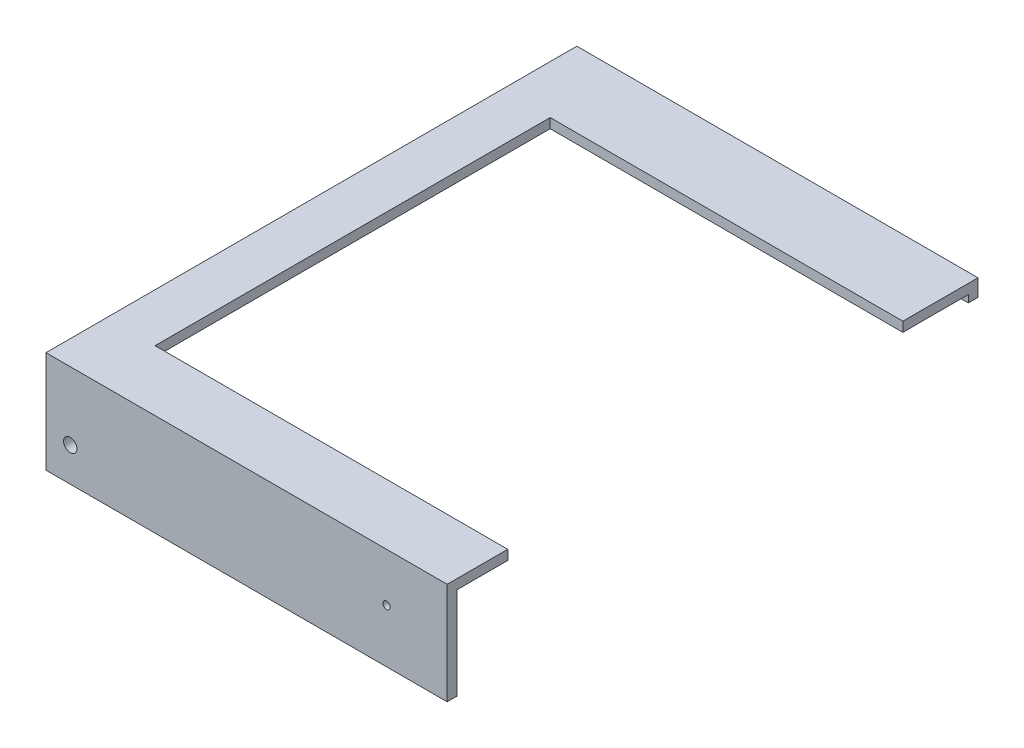
ISO-10303-21;
HEADER;
FILE_DESCRIPTION(('STEP AP214'),'2;1');
FILE_NAME('part.step','',(''),(''),'','','');
FILE_SCHEMA(('AUTOMOTIVE_DESIGN { 1 0 10303 214 1 1 1 1 }'));
ENDSEC;
DATA;
#1=APPLICATION_CONTEXT('core data for automotive mechanical design processes');
#2=APPLICATION_PROTOCOL_DEFINITION('international standard','automotive_design',2000,#1);
#3=PRODUCT_CONTEXT('',#1,'mechanical');
#4=PRODUCT('Part','Part','',(#3));
#5=PRODUCT_RELATED_PRODUCT_CATEGORY('part','',(#4));
#6=PRODUCT_DEFINITION_FORMATION('','',#4);
#7=PRODUCT_DEFINITION_CONTEXT('part definition',#1,'design');
#8=PRODUCT_DEFINITION('design','',#6,#7);
#9=PRODUCT_DEFINITION_SHAPE('','',#8);
#10=(LENGTH_UNIT() NAMED_UNIT(*) SI_UNIT(.MILLI.,.METRE.));
#11=(NAMED_UNIT(*) PLANE_ANGLE_UNIT() SI_UNIT($,.RADIAN.));
#12=(NAMED_UNIT(*) SI_UNIT($,.STERADIAN.) SOLID_ANGLE_UNIT());
#13=UNCERTAINTY_MEASURE_WITH_UNIT(LENGTH_MEASURE(1.E-05),#10,'distance_accuracy_value','');
#14=(GEOMETRIC_REPRESENTATION_CONTEXT(3) GLOBAL_UNCERTAINTY_ASSIGNED_CONTEXT((#13)) GLOBAL_UNIT_ASSIGNED_CONTEXT((#10,
#11,#12)) REPRESENTATION_CONTEXT('',''));
#15=CARTESIAN_POINT('',(0.,0.,0.));
#16=DIRECTION('',(0.,0.,1.));
#17=DIRECTION('',(1.,0.,0.));
#18=AXIS2_PLACEMENT_3D('',#15,#16,#17);
#19=CARTESIAN_POINT('',(0.,0.,-215.));
#20=DIRECTION('',(0.,0.,-1.));
#21=DIRECTION('',(1.,0.,0.));
#22=AXIS2_PLACEMENT_3D('',#19,#20,#21);
#23=PLANE('',#22);
#24=DIRECTION('',(1.,0.,0.));
#25=VECTOR('',#24,1.);
#26=CARTESIAN_POINT('',(0.,0.,-215.));
#27=LINE('',#26,#25);
#28=CARTESIAN_POINT('',(156.61803398875,0.,-215.));
#29=VERTEX_POINT('',#28);
#30=CARTESIAN_POINT('',(165.5,0.,-215.));
#31=VERTEX_POINT('',#30);
#32=EDGE_CURVE('E306',#29,#31,#27,.T.);
#33=ORIENTED_EDGE('',*,*,#32,.F.);
#34=CARTESIAN_POINT('',(155.5,1.,-215.));
#35=DIRECTION('',(0.,0.,-1.));
#36=DIRECTION('',(-1.,0.,0.));
#37=AXIS2_PLACEMENT_3D('',#34,#35,#36);
#38=CIRCLE('',#37,1.5);
#39=CARTESIAN_POINT('',(154.38196601125,0.,-215.));
#40=VERTEX_POINT('',#39);
#41=EDGE_CURVE('E176',#29,#40,#38,.T.);
#42=ORIENTED_EDGE('',*,*,#41,.T.);
#43=CARTESIAN_POINT('',(4.,0.,-215.));
#44=VERTEX_POINT('',#43);
#45=EDGE_CURVE('E174',#44,#40,#27,.T.);
#46=ORIENTED_EDGE('',*,*,#45,.F.);
#47=DIRECTION('',(0.,1.,0.));
#48=VECTOR('',#47,1.);
#49=CARTESIAN_POINT('',(4.,0.,-215.));
#50=LINE('',#49,#48);
#51=CARTESIAN_POINT('',(4.,-3.,-215.));
#52=VERTEX_POINT('',#51);
#53=EDGE_CURVE('E290',#52,#44,#50,.T.);
#54=ORIENTED_EDGE('',*,*,#53,.F.);
#55=DIRECTION('',(1.,0.,0.));
#56=VECTOR('',#55,1.);
#57=CARTESIAN_POINT('',(0.,-3.,-215.));
#58=LINE('',#57,#56);
#59=CARTESIAN_POINT('',(165.5,-3.,-215.));
#60=VERTEX_POINT('',#59);
#61=EDGE_CURVE('E226',#52,#60,#58,.T.);
#62=ORIENTED_EDGE('',*,*,#61,.T.);
#63=DIRECTION('',(0.,1.,0.));
#64=VECTOR('',#63,1.);
#65=CARTESIAN_POINT('',(165.5,4.,-215.));
#66=LINE('',#65,#64);
#67=EDGE_CURVE('E232',#60,#31,#66,.T.);
#68=ORIENTED_EDGE('',*,*,#67,.T.);
#69=EDGE_LOOP('',(#33,#42,#46,#54,#62,#68));
#70=FACE_BOUND('',#69,.T.);
#71=ADVANCED_FACE('F44',(#70),#23,.F.);
#72=CARTESIAN_POINT('',(0.,0.,4.));
#73=DIRECTION('',(1.,0.,0.));
#74=DIRECTION('',(0.,1.,0.));
#75=AXIS2_PLACEMENT_3D('',#72,#73,#74);
#76=PLANE('',#75);
#77=DIRECTION('',(0.,0.,-1.));
#78=VECTOR('',#77,1.);
#79=CARTESIAN_POINT('',(0.,-38.,4.));
#80=LINE('',#79,#78);
#81=CARTESIAN_POINT('',(0.,-38.,0.));
#82=VERTEX_POINT('',#81);
#83=CARTESIAN_POINT('',(0.,-38.,-4.));
#84=VERTEX_POINT('',#83);
#85=EDGE_CURVE('E53',#82,#84,#80,.T.);
#86=ORIENTED_EDGE('',*,*,#85,.F.);
#87=DIRECTION('',(0.,1.,0.));
#88=VECTOR('',#87,1.);
#89=CARTESIAN_POINT('',(0.,-38.,0.));
#90=LINE('',#89,#88);
#91=CARTESIAN_POINT('',(0.,4.,0.));
#92=VERTEX_POINT('',#91);
#93=EDGE_CURVE('E207',#82,#92,#90,.T.);
#94=ORIENTED_EDGE('',*,*,#93,.T.);
#95=DIRECTION('',(0.,0.,1.));
#96=VECTOR('',#95,1.);
#97=CARTESIAN_POINT('',(0.,4.,0.));
#98=LINE('',#97,#96);
#99=CARTESIAN_POINT('',(0.,4.,-219.));
#100=VERTEX_POINT('',#99);
#101=EDGE_CURVE('E339',#100,#92,#98,.T.);
#102=ORIENTED_EDGE('',*,*,#101,.F.);
#103=DIRECTION('',(0.,-1.,0.));
#104=VECTOR('',#103,1.);
#105=CARTESIAN_POINT('',(0.,4.,-219.));
#106=LINE('',#105,#104);
#107=CARTESIAN_POINT('',(0.,-3.,-219.));
#108=VERTEX_POINT('',#107);
#109=EDGE_CURVE('E227',#100,#108,#106,.T.);
#110=ORIENTED_EDGE('',*,*,#109,.T.);
#111=DIRECTION('',(0.,0.,1.));
#112=VECTOR('',#111,1.);
#113=CARTESIAN_POINT('',(0.,-3.,-219.));
#114=LINE('',#113,#112);
#115=CARTESIAN_POINT('',(0.,-3.,-215.));
#116=VERTEX_POINT('',#115);
#117=EDGE_CURVE('E256',#108,#116,#114,.T.);
#118=ORIENTED_EDGE('',*,*,#117,.T.);
#119=DIRECTION('',(0.,-1.,0.));
#120=VECTOR('',#119,1.);
#121=CARTESIAN_POINT('',(0.,4.,-215.));
#122=LINE('',#121,#120);
#123=CARTESIAN_POINT('',(0.,-10.,-215.));
#124=VERTEX_POINT('',#123);
#125=EDGE_CURVE('E312',#116,#124,#122,.T.);
#126=ORIENTED_EDGE('',*,*,#125,.T.);
#127=DIRECTION('',(0.,0.,-1.));
#128=VECTOR('',#127,1.);
#129=CARTESIAN_POINT('',(0.,-10.,-4.));
#130=LINE('',#129,#128);
#131=CARTESIAN_POINT('',(0.,-10.,-4.));
#132=VERTEX_POINT('',#131);
#133=EDGE_CURVE('E282',#132,#124,#130,.T.);
#134=ORIENTED_EDGE('',*,*,#133,.F.);
#135=DIRECTION('',(0.,-1.,0.));
#136=VECTOR('',#135,1.);
#137=CARTESIAN_POINT('',(0.,0.,-4.));
#138=LINE('',#137,#136);
#139=EDGE_CURVE('E321',#132,#84,#138,.T.);
#140=ORIENTED_EDGE('',*,*,#139,.T.);
#141=EDGE_LOOP('',(#86,#94,#102,#110,#118,#126,#134,#140));
#142=FACE_BOUND('',#141,.T.);
#143=ADVANCED_FACE('F46',(#142),#76,.F.);
#144=CARTESIAN_POINT('',(0.,-38.,4.));
#145=DIRECTION('',(0.,1.,0.));
#146=DIRECTION('',(0.,0.,1.));
#147=AXIS2_PLACEMENT_3D('',#144,#145,#146);
#148=PLANE('',#147);
#149=DIRECTION('',(0.,0.,-1.));
#150=VECTOR('',#149,1.);
#151=CARTESIAN_POINT('',(165.5,-38.,4.));
#152=LINE('',#151,#150);
#153=CARTESIAN_POINT('',(165.5,-38.,0.));
#154=VERTEX_POINT('',#153);
#155=CARTESIAN_POINT('',(165.5,-38.,-4.));
#156=VERTEX_POINT('',#155);
#157=EDGE_CURVE('E343',#154,#156,#152,.T.);
#158=ORIENTED_EDGE('',*,*,#157,.F.);
#159=DIRECTION('',(-1.,0.,0.));
#160=VECTOR('',#159,1.);
#161=CARTESIAN_POINT('',(0.,-38.,0.));
#162=LINE('',#161,#160);
#163=EDGE_CURVE('E203',#154,#82,#162,.T.);
#164=ORIENTED_EDGE('',*,*,#163,.T.);
#165=ORIENTED_EDGE('',*,*,#85,.T.);
#166=DIRECTION('',(1.,0.,0.));
#167=VECTOR('',#166,1.);
#168=CARTESIAN_POINT('',(0.,-38.,-4.));
#169=LINE('',#168,#167);
#170=EDGE_CURVE('E325',#84,#156,#169,.T.);
#171=ORIENTED_EDGE('',*,*,#170,.T.);
#172=EDGE_LOOP('',(#158,#164,#165,#171));
#173=FACE_BOUND('',#172,.T.);
#174=ADVANCED_FACE('F403',(#173),#148,.F.);
#175=CARTESIAN_POINT('',(165.5,0.,4.));
#176=DIRECTION('',(-1.,0.,0.));
#177=DIRECTION('',(0.,0.,1.));
#178=AXIS2_PLACEMENT_3D('',#175,#176,#177);
#179=PLANE('',#178);
#180=DIRECTION('',(0.,0.,-1.));
#181=VECTOR('',#180,1.);
#182=CARTESIAN_POINT('',(165.5,4.,0.));
#183=LINE('',#182,#181);
#184=CARTESIAN_POINT('',(165.5,4.,0.));
#185=VERTEX_POINT('',#184);
#186=CARTESIAN_POINT('',(165.5,4.,-25.));
#187=VERTEX_POINT('',#186);
#188=EDGE_CURVE('E336',#185,#187,#183,.T.);
#189=ORIENTED_EDGE('',*,*,#188,.F.);
#190=DIRECTION('',(0.,-1.,0.));
#191=VECTOR('',#190,1.);
#192=CARTESIAN_POINT('',(165.5,0.,0.));
#193=LINE('',#192,#191);
#194=EDGE_CURVE('E218',#185,#154,#193,.T.);
#195=ORIENTED_EDGE('',*,*,#194,.T.);
#196=ORIENTED_EDGE('',*,*,#157,.T.);
#197=DIRECTION('',(0.,1.,0.));
#198=VECTOR('',#197,1.);
#199=CARTESIAN_POINT('',(165.5,0.,-4.));
#200=LINE('',#199,#198);
#201=CARTESIAN_POINT('',(165.5,0.,-4.));
#202=VERTEX_POINT('',#201);
#203=EDGE_CURVE('E329',#156,#202,#200,.T.);
#204=ORIENTED_EDGE('',*,*,#203,.T.);
#205=DIRECTION('',(0.,0.,1.));
#206=VECTOR('',#205,1.);
#207=CARTESIAN_POINT('',(165.5,0.,0.));
#208=LINE('',#207,#206);
#209=CARTESIAN_POINT('',(165.5,0.,-25.));
#210=VERTEX_POINT('',#209);
#211=EDGE_CURVE('E269',#210,#202,#208,.T.);
#212=ORIENTED_EDGE('',*,*,#211,.F.);
#213=DIRECTION('',(0.,-1.,0.));
#214=VECTOR('',#213,1.);
#215=CARTESIAN_POINT('',(165.5,4.,-25.));
#216=LINE('',#215,#214);
#217=EDGE_CURVE('E268',#187,#210,#216,.T.);
#218=ORIENTED_EDGE('',*,*,#217,.F.);
#219=EDGE_LOOP('',(#189,#195,#196,#204,#212,#218));
#220=FACE_BOUND('',#219,.T.);
#221=ADVANCED_FACE('F405',(#220),#179,.F.);
#222=CARTESIAN_POINT('',(0.,4.,0.));
#223=DIRECTION('',(0.,1.,0.));
#224=DIRECTION('',(0.,0.,1.));
#225=AXIS2_PLACEMENT_3D('',#222,#223,#224);
#226=PLANE('',#225);
#227=DIRECTION('',(0.,0.,1.));
#228=VECTOR('',#227,1.);
#229=CARTESIAN_POINT('',(20.,4.,0.));
#230=LINE('',#229,#228);
#231=CARTESIAN_POINT('',(20.,4.,-188.));
#232=VERTEX_POINT('',#231);
#233=CARTESIAN_POINT('',(20.,4.,-25.));
#234=VERTEX_POINT('',#233);
#235=EDGE_CURVE('E309',#232,#234,#230,.T.);
#236=ORIENTED_EDGE('',*,*,#235,.F.);
#237=DIRECTION('',(1.,0.,0.));
#238=VECTOR('',#237,1.);
#239=CARTESIAN_POINT('',(20.,4.,-188.));
#240=LINE('',#239,#238);
#241=CARTESIAN_POINT('',(165.5,4.,-188.));
#242=VERTEX_POINT('',#241);
#243=EDGE_CURVE('E184',#232,#242,#240,.T.);
#244=ORIENTED_EDGE('',*,*,#243,.T.);
#245=DIRECTION('',(0.,0.,1.));
#246=VECTOR('',#245,1.);
#247=CARTESIAN_POINT('',(165.5,4.,-219.));
#248=LINE('',#247,#246);
#249=CARTESIAN_POINT('',(165.5,4.,-219.));
#250=VERTEX_POINT('',#249);
#251=EDGE_CURVE('E243',#250,#242,#248,.T.);
#252=ORIENTED_EDGE('',*,*,#251,.F.);
#253=DIRECTION('',(-1.,0.,0.));
#254=VECTOR('',#253,1.);
#255=CARTESIAN_POINT('',(0.,4.,-219.));
#256=LINE('',#255,#254);
#257=EDGE_CURVE('E239',#250,#100,#256,.T.);
#258=ORIENTED_EDGE('',*,*,#257,.T.);
#259=ORIENTED_EDGE('',*,*,#101,.T.);
#260=DIRECTION('',(-1.,0.,0.));
#261=VECTOR('',#260,1.);
#262=CARTESIAN_POINT('',(0.,4.,0.));
#263=LINE('',#262,#261);
#264=EDGE_CURVE('E200',#185,#92,#263,.T.);
#265=ORIENTED_EDGE('',*,*,#264,.F.);
#266=ORIENTED_EDGE('',*,*,#188,.T.);
#267=DIRECTION('',(1.,0.,0.));
#268=VECTOR('',#267,1.);
#269=CARTESIAN_POINT('',(20.,4.,-25.));
#270=LINE('',#269,#268);
#271=EDGE_CURVE('E264',#234,#187,#270,.T.);
#272=ORIENTED_EDGE('',*,*,#271,.F.);
#273=EDGE_LOOP('',(#236,#244,#252,#258,#259,#265,#266,#272));
#274=FACE_BOUND('',#273,.T.);
#275=ADVANCED_FACE('F367',(#274),#226,.T.);
#276=CARTESIAN_POINT('',(140.5,-16.,4.));
#277=DIRECTION('',(0.,0.,-1.));
#278=DIRECTION('',(-1.,0.,0.));
#279=AXIS2_PLACEMENT_3D('',#276,#277,#278);
#280=CYLINDRICAL_SURFACE('',#279,1.5);
#281=CARTESIAN_POINT('',(140.5,-16.,0.));
#282=DIRECTION('',(0.,0.,-1.));
#283=DIRECTION('',(-1.,0.,0.));
#284=AXIS2_PLACEMENT_3D('',#281,#282,#283);
#285=CIRCLE('',#284,1.5);
#286=CARTESIAN_POINT('',(139.,-16.,0.));
#287=VERTEX_POINT('',#286);
#288=EDGE_CURVE('E214',#287,#287,#285,.F.);
#289=ORIENTED_EDGE('',*,*,#288,.T.);
#290=EDGE_LOOP('',(#289));
#291=FACE_BOUND('',#290,.T.);
#292=CARTESIAN_POINT('',(140.5,-16.,-4.));
#293=DIRECTION('',(0.,0.,-1.));
#294=DIRECTION('',(-1.,0.,0.));
#295=AXIS2_PLACEMENT_3D('',#292,#293,#294);
#296=CIRCLE('',#295,1.5);
#297=CARTESIAN_POINT('',(139.,-16.,-4.));
#298=VERTEX_POINT('',#297);
#299=EDGE_CURVE('E259',#298,#298,#296,.T.);
#300=ORIENTED_EDGE('',*,*,#299,.T.);
#301=EDGE_LOOP('',(#300));
#302=FACE_BOUND('',#301,.T.);
#303=ADVANCED_FACE('F542',(#291,#302),#280,.F.);
#304=CARTESIAN_POINT('',(10.,-24.,4.));
#305=DIRECTION('',(0.,0.,-1.));
#306=DIRECTION('',(-1.,0.,0.));
#307=AXIS2_PLACEMENT_3D('',#304,#305,#306);
#308=CYLINDRICAL_SURFACE('',#307,2.75);
#309=CARTESIAN_POINT('',(10.,-24.,0.));
#310=DIRECTION('',(0.,0.,-1.));
#311=DIRECTION('',(-1.,0.,0.));
#312=AXIS2_PLACEMENT_3D('',#309,#310,#311);
#313=CIRCLE('',#312,2.75);
#314=CARTESIAN_POINT('',(7.25,-24.,0.));
#315=VERTEX_POINT('',#314);
#316=EDGE_CURVE('E213',#315,#315,#313,.F.);
#317=ORIENTED_EDGE('',*,*,#316,.T.);
#318=EDGE_LOOP('',(#317));
#319=FACE_BOUND('',#318,.T.);
#320=CARTESIAN_POINT('',(10.,-24.,-4.));
#321=DIRECTION('',(0.,0.,-1.));
#322=DIRECTION('',(-1.,0.,0.));
#323=AXIS2_PLACEMENT_3D('',#320,#321,#322);
#324=CIRCLE('',#323,2.75);
#325=CARTESIAN_POINT('',(7.25,-24.,-4.));
#326=VERTEX_POINT('',#325);
#327=EDGE_CURVE('E222',#326,#326,#324,.T.);
#328=ORIENTED_EDGE('',*,*,#327,.T.);
#329=EDGE_LOOP('',(#328));
#330=FACE_BOUND('',#329,.T.);
#331=ADVANCED_FACE('F351',(#319,#330),#308,.F.);
#332=CARTESIAN_POINT('',(0.,4.,-215.));
#333=DIRECTION('',(0.,0.,1.));
#334=DIRECTION('',(-1.,0.,0.));
#335=AXIS2_PLACEMENT_3D('',#332,#333,#334);
#336=PLANE('',#335);
#337=EDGE_CURVE('E244',#116,#52,#58,.T.);
#338=ORIENTED_EDGE('',*,*,#337,.T.);
#339=CARTESIAN_POINT('',(4.,-10.,-215.));
#340=VERTEX_POINT('',#339);
#341=EDGE_CURVE('E291',#340,#52,#50,.T.);
#342=ORIENTED_EDGE('',*,*,#341,.F.);
#343=DIRECTION('',(-1.,0.,0.));
#344=VECTOR('',#343,1.);
#345=CARTESIAN_POINT('',(4.,-10.,-215.));
#346=LINE('',#345,#344);
#347=EDGE_CURVE('E302',#340,#124,#346,.T.);
#348=ORIENTED_EDGE('',*,*,#347,.T.);
#349=ORIENTED_EDGE('',*,*,#125,.F.);
#350=EDGE_LOOP('',(#338,#342,#348,#349));
#351=FACE_BOUND('',#350,.T.);
#352=ADVANCED_FACE('F378',(#351),#336,.F.);
#353=CARTESIAN_POINT('',(20.,4.,0.));
#354=DIRECTION('',(-1.,0.,0.));
#355=DIRECTION('',(0.,0.,-1.));
#356=AXIS2_PLACEMENT_3D('',#353,#354,#355);
#357=PLANE('',#356);
#358=DIRECTION('',(0.,0.,1.));
#359=VECTOR('',#358,1.);
#360=CARTESIAN_POINT('',(20.,0.,0.));
#361=LINE('',#360,#359);
#362=CARTESIAN_POINT('',(20.,0.,-188.));
#363=VERTEX_POINT('',#362);
#364=CARTESIAN_POINT('',(20.,0.,-25.));
#365=VERTEX_POINT('',#364);
#366=EDGE_CURVE('E313',#363,#365,#361,.T.);
#367=ORIENTED_EDGE('',*,*,#366,.F.);
#368=DIRECTION('',(0.,1.,0.));
#369=VECTOR('',#368,1.);
#370=CARTESIAN_POINT('',(20.,0.,-188.));
#371=LINE('',#370,#369);
#372=EDGE_CURVE('E66',#363,#232,#371,.T.);
#373=ORIENTED_EDGE('',*,*,#372,.T.);
#374=ORIENTED_EDGE('',*,*,#235,.T.);
#375=DIRECTION('',(0.,-1.,0.));
#376=VECTOR('',#375,1.);
#377=CARTESIAN_POINT('',(20.,4.,-25.));
#378=LINE('',#377,#376);
#379=EDGE_CURVE('E278',#234,#365,#378,.T.);
#380=ORIENTED_EDGE('',*,*,#379,.T.);
#381=EDGE_LOOP('',(#367,#373,#374,#380));
#382=FACE_BOUND('',#381,.T.);
#383=ADVANCED_FACE('F413',(#382),#357,.F.);
#384=CARTESIAN_POINT('',(0.,0.,0.));
#385=DIRECTION('',(0.,1.,0.));
#386=DIRECTION('',(0.,0.,-1.));
#387=AXIS2_PLACEMENT_3D('',#384,#385,#386);
#388=PLANE('',#387);
#389=DIRECTION('',(-1.,0.,0.));
#390=VECTOR('',#389,1.);
#391=CARTESIAN_POINT('',(0.,0.,-199.));
#392=LINE('',#391,#390);
#393=CARTESIAN_POINT('',(156.61803398875,0.,-199.));
#394=VERTEX_POINT('',#393);
#395=CARTESIAN_POINT('',(154.38196601125,0.,-199.));
#396=VERTEX_POINT('',#395);
#397=EDGE_CURVE('E11',#394,#396,#392,.T.);
#398=ORIENTED_EDGE('',*,*,#397,.F.);
#399=DIRECTION('',(0.,0.,-1.));
#400=VECTOR('',#399,1.);
#401=CARTESIAN_POINT('',(156.61803398875,0.,-199.));
#402=LINE('',#401,#400);
#403=EDGE_CURVE('E166',#394,#29,#402,.T.);
#404=ORIENTED_EDGE('',*,*,#403,.T.);
#405=ORIENTED_EDGE('',*,*,#32,.T.);
#406=DIRECTION('',(0.,0.,-1.));
#407=VECTOR('',#406,1.);
#408=CARTESIAN_POINT('',(165.5,0.,-215.));
#409=LINE('',#408,#407);
#410=CARTESIAN_POINT('',(165.5,0.,-188.));
#411=VERTEX_POINT('',#410);
#412=EDGE_CURVE('E189',#411,#31,#409,.T.);
#413=ORIENTED_EDGE('',*,*,#412,.F.);
#414=DIRECTION('',(1.,0.,0.));
#415=VECTOR('',#414,1.);
#416=CARTESIAN_POINT('',(20.,0.,-188.));
#417=LINE('',#416,#415);
#418=EDGE_CURVE('E185',#363,#411,#417,.T.);
#419=ORIENTED_EDGE('',*,*,#418,.F.);
#420=ORIENTED_EDGE('',*,*,#366,.T.);
#421=DIRECTION('',(1.,0.,0.));
#422=VECTOR('',#421,1.);
#423=CARTESIAN_POINT('',(20.,0.,-25.));
#424=LINE('',#423,#422);
#425=EDGE_CURVE('E263',#365,#210,#424,.T.);
#426=ORIENTED_EDGE('',*,*,#425,.T.);
#427=ORIENTED_EDGE('',*,*,#211,.T.);
#428=DIRECTION('',(-1.,0.,0.));
#429=VECTOR('',#428,1.);
#430=CARTESIAN_POINT('',(0.,0.,-4.));
#431=LINE('',#430,#429);
#432=CARTESIAN_POINT('',(4.,0.,-4.));
#433=VERTEX_POINT('',#432);
#434=EDGE_CURVE('E332',#202,#433,#431,.T.);
#435=ORIENTED_EDGE('',*,*,#434,.T.);
#436=DIRECTION('',(0.,0.,1.));
#437=VECTOR('',#436,1.);
#438=CARTESIAN_POINT('',(4.,0.,-4.));
#439=LINE('',#438,#437);
#440=EDGE_CURVE('E295',#44,#433,#439,.T.);
#441=ORIENTED_EDGE('',*,*,#440,.F.);
#442=ORIENTED_EDGE('',*,*,#45,.T.);
#443=DIRECTION('',(0.,0.,-1.));
#444=VECTOR('',#443,1.);
#445=CARTESIAN_POINT('',(154.38196601125,0.,-199.));
#446=LINE('',#445,#444);
#447=EDGE_CURVE('E164',#40,#396,#446,.F.);
#448=ORIENTED_EDGE('',*,*,#447,.T.);
#449=EDGE_LOOP('',(#398,#404,#405,#413,#419,#420,#426,#427,#435,#441,#442,#448));
#450=FACE_BOUND('',#449,.T.);
#451=ADVANCED_FACE('F171',(#450),#388,.F.);
#452=CARTESIAN_POINT('',(0.,0.,-4.));
#453=DIRECTION('',(0.,0.,-1.));
#454=DIRECTION('',(1.,0.,0.));
#455=AXIS2_PLACEMENT_3D('',#452,#453,#454);
#456=PLANE('',#455);
#457=ORIENTED_EDGE('',*,*,#327,.F.);
#458=EDGE_LOOP('',(#457));
#459=FACE_BOUND('',#458,.T.);
#460=ORIENTED_EDGE('',*,*,#299,.F.);
#461=EDGE_LOOP('',(#460));
#462=FACE_BOUND('',#461,.T.);
#463=DIRECTION('',(-1.,0.,0.));
#464=VECTOR('',#463,1.);
#465=CARTESIAN_POINT('',(4.,-10.,-4.));
#466=LINE('',#465,#464);
#467=CARTESIAN_POINT('',(4.,-10.,-4.));
#468=VERTEX_POINT('',#467);
#469=EDGE_CURVE('E299',#468,#132,#466,.T.);
#470=ORIENTED_EDGE('',*,*,#469,.F.);
#471=DIRECTION('',(0.,-1.,0.));
#472=VECTOR('',#471,1.);
#473=CARTESIAN_POINT('',(4.,0.,-4.));
#474=LINE('',#473,#472);
#475=EDGE_CURVE('E283',#433,#468,#474,.T.);
#476=ORIENTED_EDGE('',*,*,#475,.F.);
#477=ORIENTED_EDGE('',*,*,#434,.F.);
#478=ORIENTED_EDGE('',*,*,#203,.F.);
#479=ORIENTED_EDGE('',*,*,#170,.F.);
#480=ORIENTED_EDGE('',*,*,#139,.F.);
#481=EDGE_LOOP('',(#470,#476,#477,#478,#479,#480));
#482=FACE_BOUND('',#481,.T.);
#483=ADVANCED_FACE('F398',(#459,#462,#482),#456,.T.);
#484=CARTESIAN_POINT('',(4.,-10.,-4.));
#485=DIRECTION('',(0.,-1.,0.));
#486=DIRECTION('',(1.,0.,0.));
#487=AXIS2_PLACEMENT_3D('',#484,#485,#486);
#488=PLANE('',#487);
#489=ORIENTED_EDGE('',*,*,#133,.T.);
#490=ORIENTED_EDGE('',*,*,#347,.F.);
#491=DIRECTION('',(0.,0.,-1.));
#492=VECTOR('',#491,1.);
#493=CARTESIAN_POINT('',(4.,-10.,-4.));
#494=LINE('',#493,#492);
#495=EDGE_CURVE('E287',#468,#340,#494,.T.);
#496=ORIENTED_EDGE('',*,*,#495,.F.);
#497=ORIENTED_EDGE('',*,*,#469,.T.);
#498=EDGE_LOOP('',(#489,#490,#496,#497));
#499=FACE_BOUND('',#498,.T.);
#500=ADVANCED_FACE('F394',(#499),#488,.T.);
#501=CARTESIAN_POINT('',(4.,0.,0.));
#502=DIRECTION('',(-1.,0.,0.));
#503=DIRECTION('',(0.,-1.,0.));
#504=AXIS2_PLACEMENT_3D('',#501,#502,#503);
#505=PLANE('',#504);
#506=ORIENTED_EDGE('',*,*,#475,.T.);
#507=ORIENTED_EDGE('',*,*,#495,.T.);
#508=ORIENTED_EDGE('',*,*,#341,.T.);
#509=ORIENTED_EDGE('',*,*,#53,.T.);
#510=ORIENTED_EDGE('',*,*,#440,.T.);
#511=EDGE_LOOP('',(#506,#507,#508,#509,#510));
#512=FACE_BOUND('',#511,.T.);
#513=ADVANCED_FACE('F391',(#512),#505,.F.);
#514=CARTESIAN_POINT('',(20.,4.,-25.));
#515=DIRECTION('',(0.,0.,1.));
#516=DIRECTION('',(-1.,0.,0.));
#517=AXIS2_PLACEMENT_3D('',#514,#515,#516);
#518=PLANE('',#517);
#519=ORIENTED_EDGE('',*,*,#425,.F.);
#520=ORIENTED_EDGE('',*,*,#379,.F.);
#521=ORIENTED_EDGE('',*,*,#271,.T.);
#522=ORIENTED_EDGE('',*,*,#217,.T.);
#523=EDGE_LOOP('',(#519,#520,#521,#522));
#524=FACE_BOUND('',#523,.T.);
#525=ADVANCED_FACE('F412',(#524),#518,.F.);
#526=CARTESIAN_POINT('',(0.,-3.,-219.));
#527=DIRECTION('',(0.,1.,0.));
#528=DIRECTION('',(0.,0.,-1.));
#529=AXIS2_PLACEMENT_3D('',#526,#527,#528);
#530=PLANE('',#529);
#531=ORIENTED_EDGE('',*,*,#337,.F.);
#532=ORIENTED_EDGE('',*,*,#117,.F.);
#533=DIRECTION('',(1.,0.,0.));
#534=VECTOR('',#533,1.);
#535=CARTESIAN_POINT('',(0.,-3.,-219.));
#536=LINE('',#535,#534);
#537=CARTESIAN_POINT('',(165.5,-3.,-219.));
#538=VERTEX_POINT('',#537);
#539=EDGE_CURVE('E231',#108,#538,#536,.T.);
#540=ORIENTED_EDGE('',*,*,#539,.T.);
#541=DIRECTION('',(0.,0.,1.));
#542=VECTOR('',#541,1.);
#543=CARTESIAN_POINT('',(165.5,-3.,-219.));
#544=LINE('',#543,#542);
#545=EDGE_CURVE('E253',#538,#60,#544,.T.);
#546=ORIENTED_EDGE('',*,*,#545,.T.);
#547=ORIENTED_EDGE('',*,*,#61,.F.);
#548=EDGE_LOOP('',(#531,#532,#540,#546,#547));
#549=FACE_BOUND('',#548,.T.);
#550=ADVANCED_FACE('F381',(#549),#530,.F.);
#551=CARTESIAN_POINT('',(165.5,4.,-219.));
#552=DIRECTION('',(-1.,0.,0.));
#553=DIRECTION('',(0.,0.,-1.));
#554=AXIS2_PLACEMENT_3D('',#551,#552,#553);
#555=PLANE('',#554);
#556=ORIENTED_EDGE('',*,*,#67,.F.);
#557=ORIENTED_EDGE('',*,*,#545,.F.);
#558=DIRECTION('',(0.,1.,0.));
#559=VECTOR('',#558,1.);
#560=CARTESIAN_POINT('',(165.5,4.,-219.));
#561=LINE('',#560,#559);
#562=EDGE_CURVE('E236',#538,#250,#561,.T.);
#563=ORIENTED_EDGE('',*,*,#562,.T.);
#564=ORIENTED_EDGE('',*,*,#251,.T.);
#565=DIRECTION('',(0.,1.,0.));
#566=VECTOR('',#565,1.);
#567=CARTESIAN_POINT('',(165.5,0.,-188.));
#568=LINE('',#567,#566);
#569=EDGE_CURVE('E196',#411,#242,#568,.T.);
#570=ORIENTED_EDGE('',*,*,#569,.F.);
#571=ORIENTED_EDGE('',*,*,#412,.T.);
#572=EDGE_LOOP('',(#556,#557,#563,#564,#570,#571));
#573=FACE_BOUND('',#572,.T.);
#574=ADVANCED_FACE('F419',(#573),#555,.F.);
#575=CARTESIAN_POINT('',(0.,0.,-219.));
#576=DIRECTION('',(0.,0.,-1.));
#577=DIRECTION('',(1.,0.,0.));
#578=AXIS2_PLACEMENT_3D('',#575,#576,#577);
#579=PLANE('',#578);
#580=CARTESIAN_POINT('',(155.5,1.,-219.));
#581=DIRECTION('',(0.,0.,-1.));
#582=DIRECTION('',(-1.,0.,0.));
#583=AXIS2_PLACEMENT_3D('',#580,#581,#582);
#584=CIRCLE('',#583,1.5);
#585=CARTESIAN_POINT('',(154.,1.,-219.));
#586=VERTEX_POINT('',#585);
#587=EDGE_CURVE('E168',#586,#586,#584,.T.);
#588=ORIENTED_EDGE('',*,*,#587,.F.);
#589=EDGE_LOOP('',(#588));
#590=FACE_BOUND('',#589,.T.);
#591=ORIENTED_EDGE('',*,*,#109,.F.);
#592=ORIENTED_EDGE('',*,*,#257,.F.);
#593=ORIENTED_EDGE('',*,*,#562,.F.);
#594=ORIENTED_EDGE('',*,*,#539,.F.);
#595=EDGE_LOOP('',(#591,#592,#593,#594));
#596=FACE_BOUND('',#595,.T.);
#597=ADVANCED_FACE('F358',(#590,#596),#579,.T.);
#598=CARTESIAN_POINT('',(0.,-38.,0.));
#599=DIRECTION('',(0.,0.,-1.));
#600=DIRECTION('',(-1.,0.,0.));
#601=AXIS2_PLACEMENT_3D('',#598,#599,#600);
#602=PLANE('',#601);
#603=ORIENTED_EDGE('',*,*,#316,.F.);
#604=EDGE_LOOP('',(#603));
#605=FACE_BOUND('',#604,.T.);
#606=ORIENTED_EDGE('',*,*,#288,.F.);
#607=EDGE_LOOP('',(#606));
#608=FACE_BOUND('',#607,.T.);
#609=ORIENTED_EDGE('',*,*,#264,.T.);
#610=ORIENTED_EDGE('',*,*,#93,.F.);
#611=ORIENTED_EDGE('',*,*,#163,.F.);
#612=ORIENTED_EDGE('',*,*,#194,.F.);
#613=EDGE_LOOP('',(#609,#610,#611,#612));
#614=FACE_BOUND('',#613,.T.);
#615=ADVANCED_FACE('F354',(#605,#608,#614),#602,.F.);
#616=CARTESIAN_POINT('',(20.,0.,-188.));
#617=DIRECTION('',(0.,0.,1.));
#618=DIRECTION('',(1.,0.,0.));
#619=AXIS2_PLACEMENT_3D('',#616,#617,#618);
#620=PLANE('',#619);
#621=ORIENTED_EDGE('',*,*,#243,.F.);
#622=ORIENTED_EDGE('',*,*,#372,.F.);
#623=ORIENTED_EDGE('',*,*,#418,.T.);
#624=ORIENTED_EDGE('',*,*,#569,.T.);
#625=EDGE_LOOP('',(#621,#622,#623,#624));
#626=FACE_BOUND('',#625,.T.);
#627=ADVANCED_FACE('F357',(#626),#620,.T.);
#628=CARTESIAN_POINT('',(155.5,1.,-199.));
#629=DIRECTION('',(0.,0.,-1.));
#630=DIRECTION('',(-1.,0.,0.));
#631=AXIS2_PLACEMENT_3D('',#628,#629,#630);
#632=PLANE('',#631);
#633=ORIENTED_EDGE('',*,*,#397,.T.);
#634=CARTESIAN_POINT('',(155.5,1.,-199.));
#635=DIRECTION('',(0.,0.,-1.));
#636=DIRECTION('',(-1.,0.,0.));
#637=AXIS2_PLACEMENT_3D('',#634,#635,#636);
#638=CIRCLE('',#637,1.5);
#639=EDGE_CURVE('E58',#396,#394,#638,.T.);
#640=ORIENTED_EDGE('',*,*,#639,.T.);
#641=EDGE_LOOP('',(#633,#640));
#642=FACE_BOUND('',#641,.T.);
#643=ADVANCED_FACE('F158',(#642),#632,.T.);
#644=CARTESIAN_POINT('',(155.5,1.,-199.));
#645=DIRECTION('',(0.,0.,-1.));
#646=DIRECTION('',(-1.,0.,0.));
#647=AXIS2_PLACEMENT_3D('',#644,#645,#646);
#648=CYLINDRICAL_SURFACE('',#647,1.5);
#649=ORIENTED_EDGE('',*,*,#587,.T.);
#650=EDGE_LOOP('',(#649));
#651=FACE_BOUND('',#650,.T.);
#652=ORIENTED_EDGE('',*,*,#639,.F.);
#653=ORIENTED_EDGE('',*,*,#447,.F.);
#654=ORIENTED_EDGE('',*,*,#41,.F.);
#655=ORIENTED_EDGE('',*,*,#403,.F.);
#656=EDGE_LOOP('',(#652,#653,#654,#655));
#657=FACE_BOUND('',#656,.T.);
#658=ADVANCED_FACE('F163',(#651,#657),#648,.F.);
#659=CLOSED_SHELL('',(#71,#143,#174,#221,#275,#303,#331,#352,#383,#451,#483,#500,#513,#525,#550,
#574,#597,#615,#627,#643,#658));
#660=MANIFOLD_SOLID_BREP('B2',#659);
#661=ADVANCED_BREP_SHAPE_REPRESENTATION('',(#18,#660),#14);
#662=SHAPE_DEFINITION_REPRESENTATION(#9,#661);
ENDSEC;
END-ISO-10303-21;
